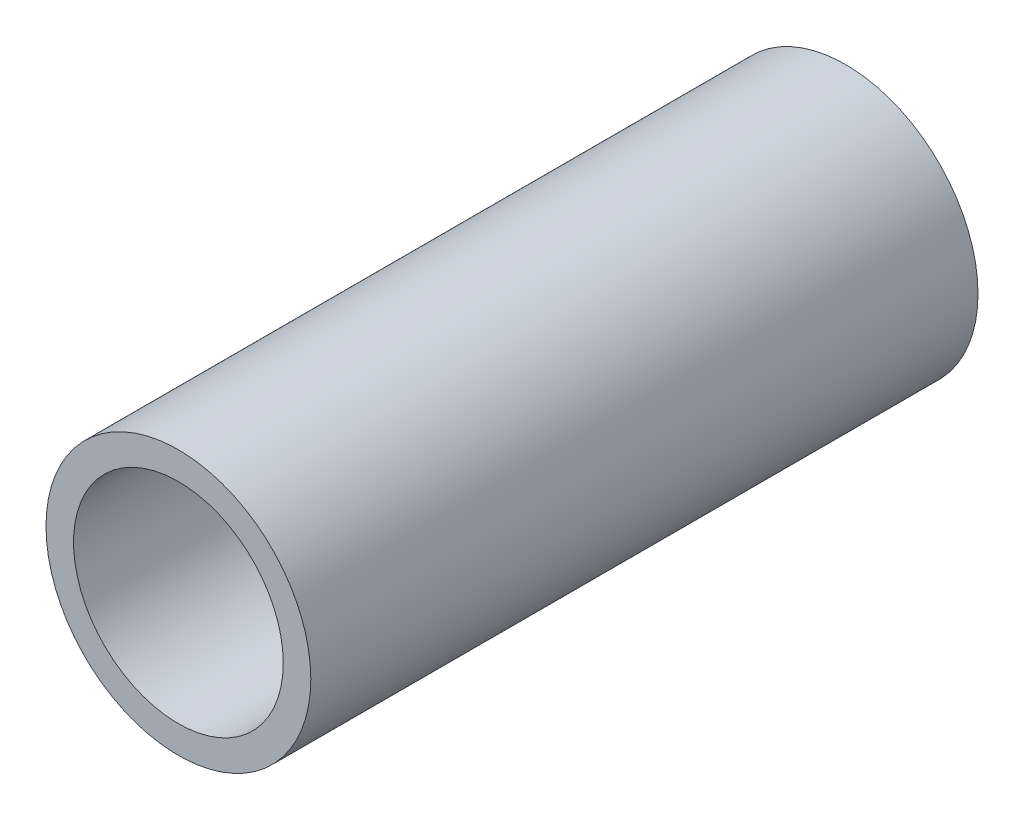
ISO-10303-21;
HEADER;
FILE_DESCRIPTION(('STEP AP214'),'2;1');
FILE_NAME('part.step','',(''),(''),'','','');
FILE_SCHEMA(('AUTOMOTIVE_DESIGN { 1 0 10303 214 1 1 1 1 }'));
ENDSEC;
DATA;
#1=APPLICATION_CONTEXT('core data for automotive mechanical design processes');
#2=APPLICATION_PROTOCOL_DEFINITION('international standard','automotive_design',2000,#1);
#3=PRODUCT_CONTEXT('',#1,'mechanical');
#4=PRODUCT('Part','Part','',(#3));
#5=PRODUCT_RELATED_PRODUCT_CATEGORY('part','',(#4));
#6=PRODUCT_DEFINITION_FORMATION('','',#4);
#7=PRODUCT_DEFINITION_CONTEXT('part definition',#1,'design');
#8=PRODUCT_DEFINITION('design','',#6,#7);
#9=PRODUCT_DEFINITION_SHAPE('','',#8);
#10=(LENGTH_UNIT() NAMED_UNIT(*) SI_UNIT(.MILLI.,.METRE.));
#11=(NAMED_UNIT(*) PLANE_ANGLE_UNIT() SI_UNIT($,.RADIAN.));
#12=(NAMED_UNIT(*) SI_UNIT($,.STERADIAN.) SOLID_ANGLE_UNIT());
#13=UNCERTAINTY_MEASURE_WITH_UNIT(LENGTH_MEASURE(1.E-05),#10,'distance_accuracy_value','');
#14=(GEOMETRIC_REPRESENTATION_CONTEXT(3) GLOBAL_UNCERTAINTY_ASSIGNED_CONTEXT((#13)) GLOBAL_UNIT_ASSIGNED_CONTEXT((#10,
#11,#12)) REPRESENTATION_CONTEXT('',''));
#15=CARTESIAN_POINT('',(0.,0.,0.));
#16=DIRECTION('',(0.,0.,1.));
#17=DIRECTION('',(1.,0.,0.));
#18=AXIS2_PLACEMENT_3D('',#15,#16,#17);
#19=CARTESIAN_POINT('',(0.,0.,40.));
#20=DIRECTION('',(0.,0.,1.));
#21=DIRECTION('',(1.,0.,0.));
#22=AXIS2_PLACEMENT_3D('',#19,#20,#21);
#23=PLANE('',#22);
#24=CARTESIAN_POINT('',(0.,0.,40.));
#25=DIRECTION('',(0.,0.,1.));
#26=DIRECTION('',(1.,0.,0.));
#27=AXIS2_PLACEMENT_3D('',#24,#25,#26);
#28=CIRCLE('',#27,7.9375);
#29=CARTESIAN_POINT('',(7.9375,0.,40.));
#30=VERTEX_POINT('',#29);
#31=EDGE_CURVE('E10',#30,#30,#28,.T.);
#32=ORIENTED_EDGE('',*,*,#31,.T.);
#33=EDGE_LOOP('',(#32));
#34=FACE_BOUND('',#33,.T.);
#35=CARTESIAN_POINT('',(0.,0.,40.));
#36=DIRECTION('',(0.,0.,1.));
#37=DIRECTION('',(1.,0.,0.));
#38=AXIS2_PLACEMENT_3D('',#35,#36,#37);
#39=CIRCLE('',#38,6.2865);
#40=CARTESIAN_POINT('',(6.2865,0.,40.));
#41=VERTEX_POINT('',#40);
#42=EDGE_CURVE('E56',#41,#41,#39,.T.);
#43=ORIENTED_EDGE('',*,*,#42,.F.);
#44=EDGE_LOOP('',(#43));
#45=FACE_BOUND('',#44,.T.);
#46=ADVANCED_FACE('F43',(#34,#45),#23,.T.);
#47=CARTESIAN_POINT('',(0.,0.,0.));
#48=DIRECTION('',(0.,0.,1.));
#49=DIRECTION('',(1.,0.,0.));
#50=AXIS2_PLACEMENT_3D('',#47,#48,#49);
#51=PLANE('',#50);
#52=CARTESIAN_POINT('',(0.,0.,0.));
#53=DIRECTION('',(0.,0.,1.));
#54=DIRECTION('',(1.,0.,0.));
#55=AXIS2_PLACEMENT_3D('',#52,#53,#54);
#56=CIRCLE('',#55,7.9375);
#57=CARTESIAN_POINT('',(7.9375,0.,0.));
#58=VERTEX_POINT('',#57);
#59=EDGE_CURVE('E47',#58,#58,#56,.T.);
#60=ORIENTED_EDGE('',*,*,#59,.F.);
#61=EDGE_LOOP('',(#60));
#62=FACE_BOUND('',#61,.T.);
#63=CARTESIAN_POINT('',(0.,0.,0.));
#64=DIRECTION('',(0.,0.,1.));
#65=DIRECTION('',(1.,0.,0.));
#66=AXIS2_PLACEMENT_3D('',#63,#64,#65);
#67=CIRCLE('',#66,6.2865);
#68=CARTESIAN_POINT('',(6.2865,0.,0.));
#69=VERTEX_POINT('',#68);
#70=EDGE_CURVE('E58',#69,#69,#67,.T.);
#71=ORIENTED_EDGE('',*,*,#70,.T.);
#72=EDGE_LOOP('',(#71));
#73=FACE_BOUND('',#72,.T.);
#74=ADVANCED_FACE('F70',(#62,#73),#51,.F.);
#75=CARTESIAN_POINT('',(0.,0.,40.));
#76=DIRECTION('',(0.,0.,-1.));
#77=DIRECTION('',(-1.,0.,0.));
#78=AXIS2_PLACEMENT_3D('',#75,#76,#77);
#79=CYLINDRICAL_SURFACE('',#78,7.9375);
#80=ORIENTED_EDGE('',*,*,#31,.F.);
#81=EDGE_LOOP('',(#80));
#82=FACE_BOUND('',#81,.T.);
#83=ORIENTED_EDGE('',*,*,#59,.T.);
#84=EDGE_LOOP('',(#83));
#85=FACE_BOUND('',#84,.T.);
#86=ADVANCED_FACE('F45',(#82,#85),#79,.T.);
#87=CARTESIAN_POINT('',(0.,0.,40.));
#88=DIRECTION('',(0.,0.,-1.));
#89=DIRECTION('',(-1.,0.,0.));
#90=AXIS2_PLACEMENT_3D('',#87,#88,#89);
#91=CYLINDRICAL_SURFACE('',#90,6.2865);
#92=ORIENTED_EDGE('',*,*,#42,.T.);
#93=EDGE_LOOP('',(#92));
#94=FACE_BOUND('',#93,.T.);
#95=ORIENTED_EDGE('',*,*,#70,.F.);
#96=EDGE_LOOP('',(#95));
#97=FACE_BOUND('',#96,.T.);
#98=ADVANCED_FACE('F66',(#94,#97),#91,.F.);
#99=CLOSED_SHELL('',(#46,#74,#86,#98));
#100=MANIFOLD_SOLID_BREP('B2',#99);
#101=ADVANCED_BREP_SHAPE_REPRESENTATION('',(#18,#100),#14);
#102=SHAPE_DEFINITION_REPRESENTATION(#9,#101);
ENDSEC;
END-ISO-10303-21;
